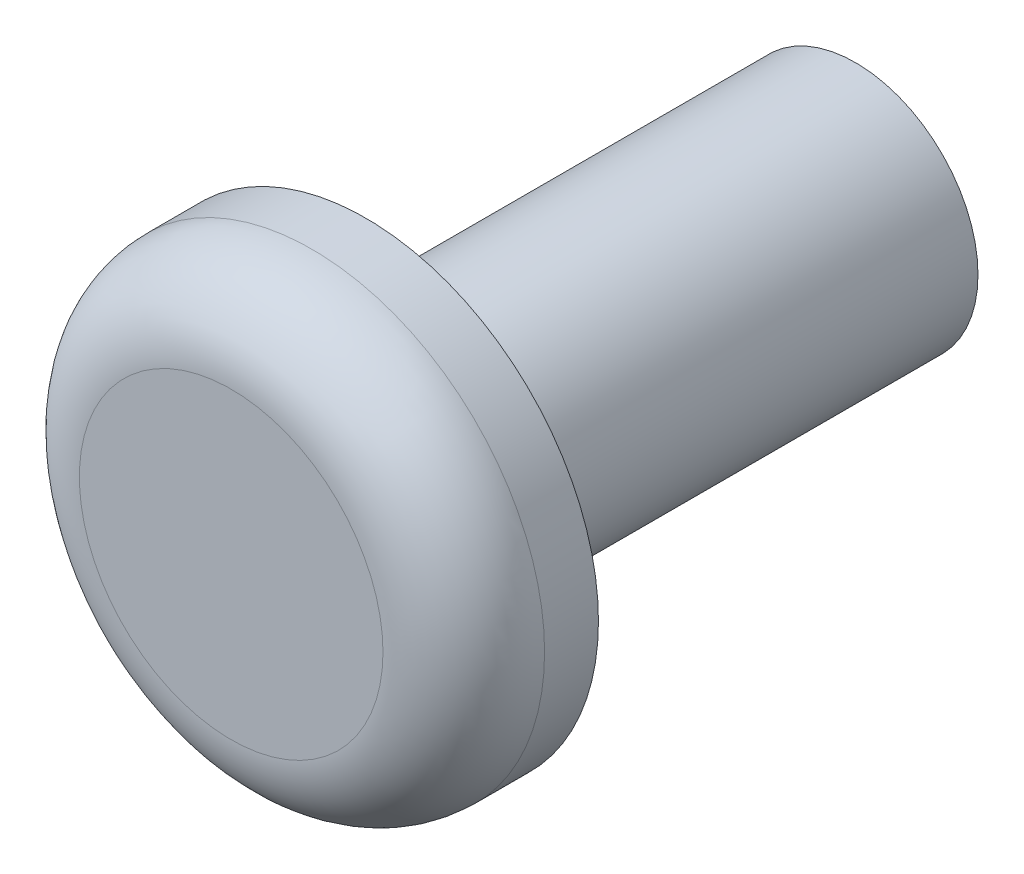
ISO-10303-21;
HEADER;
FILE_DESCRIPTION(('STEP AP214'),'2;1');
FILE_NAME('part.step','',(''),(''),'','','');
FILE_SCHEMA(('AUTOMOTIVE_DESIGN { 1 0 10303 214 1 1 1 1 }'));
ENDSEC;
DATA;
#1=APPLICATION_CONTEXT('core data for automotive mechanical design processes');
#2=APPLICATION_PROTOCOL_DEFINITION('international standard','automotive_design',2000,#1);
#3=PRODUCT_CONTEXT('',#1,'mechanical');
#4=PRODUCT('Part','Part','',(#3));
#5=PRODUCT_RELATED_PRODUCT_CATEGORY('part','',(#4));
#6=PRODUCT_DEFINITION_FORMATION('','',#4);
#7=PRODUCT_DEFINITION_CONTEXT('part definition',#1,'design');
#8=PRODUCT_DEFINITION('design','',#6,#7);
#9=PRODUCT_DEFINITION_SHAPE('','',#8);
#10=(LENGTH_UNIT() NAMED_UNIT(*) SI_UNIT(.MILLI.,.METRE.));
#11=(NAMED_UNIT(*) PLANE_ANGLE_UNIT() SI_UNIT($,.RADIAN.));
#12=(NAMED_UNIT(*) SI_UNIT($,.STERADIAN.) SOLID_ANGLE_UNIT());
#13=UNCERTAINTY_MEASURE_WITH_UNIT(LENGTH_MEASURE(1.E-05),#10,'distance_accuracy_value','');
#14=(GEOMETRIC_REPRESENTATION_CONTEXT(3) GLOBAL_UNCERTAINTY_ASSIGNED_CONTEXT((#13)) GLOBAL_UNIT_ASSIGNED_CONTEXT((#10,
#11,#12)) REPRESENTATION_CONTEXT('',''));
#15=CARTESIAN_POINT('',(0.,0.,0.));
#16=DIRECTION('',(0.,0.,1.));
#17=DIRECTION('',(1.,0.,0.));
#18=AXIS2_PLACEMENT_3D('',#15,#16,#17);
#19=CARTESIAN_POINT('',(0.,0.,-10.));
#20=DIRECTION('',(0.,0.,1.));
#21=DIRECTION('',(1.,0.,0.));
#22=AXIS2_PLACEMENT_3D('',#19,#20,#21);
#23=PLANE('',#22);
#24=CARTESIAN_POINT('',(0.,0.,-10.));
#25=DIRECTION('',(0.,0.,1.));
#26=DIRECTION('',(1.,0.,0.));
#27=AXIS2_PLACEMENT_3D('',#24,#25,#26);
#28=CIRCLE('',#27,2.5);
#29=CARTESIAN_POINT('',(2.5,0.,-10.));
#30=VERTEX_POINT('',#29);
#31=EDGE_CURVE('E10',#30,#30,#28,.T.);
#32=ORIENTED_EDGE('',*,*,#31,.F.);
#33=EDGE_LOOP('',(#32));
#34=FACE_BOUND('',#33,.T.);
#35=ADVANCED_FACE('F15',(#34),#23,.F.);
#36=CARTESIAN_POINT('',(0.,0.,0.));
#37=DIRECTION('',(0.,0.,1.));
#38=DIRECTION('',(1.,0.,0.));
#39=AXIS2_PLACEMENT_3D('',#36,#37,#38);
#40=CYLINDRICAL_SURFACE('',#39,2.5);
#41=ORIENTED_EDGE('',*,*,#31,.T.);
#42=EDGE_LOOP('',(#41));
#43=FACE_BOUND('',#42,.T.);
#44=CARTESIAN_POINT('',(0.,0.,0.));
#45=DIRECTION('',(0.,0.,1.));
#46=DIRECTION('',(1.,0.,0.));
#47=AXIS2_PLACEMENT_3D('',#44,#45,#46);
#48=CIRCLE('',#47,2.5);
#49=CARTESIAN_POINT('',(2.5,0.,0.));
#50=VERTEX_POINT('',#49);
#51=EDGE_CURVE('E22',#50,#50,#48,.T.);
#52=ORIENTED_EDGE('',*,*,#51,.F.);
#53=EDGE_LOOP('',(#52));
#54=FACE_BOUND('',#53,.T.);
#55=ADVANCED_FACE('F62',(#43,#54),#40,.T.);
#56=CARTESIAN_POINT('',(0.,0.,2.75));
#57=DIRECTION('',(0.,0.,1.));
#58=DIRECTION('',(1.,0.,0.));
#59=AXIS2_PLACEMENT_3D('',#56,#57,#58);
#60=PLANE('',#59);
#61=CARTESIAN_POINT('',(0.,0.,2.75));
#62=DIRECTION('',(0.,0.,1.));
#63=DIRECTION('',(1.,0.,0.));
#64=AXIS2_PLACEMENT_3D('',#61,#62,#63);
#65=CIRCLE('',#64,3.1);
#66=CARTESIAN_POINT('',(3.1,0.,2.75));
#67=VERTEX_POINT('',#66);
#68=EDGE_CURVE('E28',#67,#67,#65,.T.);
#69=ORIENTED_EDGE('',*,*,#68,.T.);
#70=EDGE_LOOP('',(#69));
#71=FACE_BOUND('',#70,.T.);
#72=ADVANCED_FACE('F52',(#71),#60,.T.);
#73=CARTESIAN_POINT('',(0.,0.,0.));
#74=DIRECTION('',(0.,0.,1.));
#75=DIRECTION('',(1.,0.,0.));
#76=AXIS2_PLACEMENT_3D('',#73,#74,#75);
#77=PLANE('',#76);
#78=ORIENTED_EDGE('',*,*,#51,.T.);
#79=EDGE_LOOP('',(#78));
#80=FACE_BOUND('',#79,.T.);
#81=CARTESIAN_POINT('',(0.,0.,0.));
#82=DIRECTION('',(0.,0.,1.));
#83=DIRECTION('',(1.,0.,0.));
#84=AXIS2_PLACEMENT_3D('',#81,#82,#83);
#85=CIRCLE('',#84,4.75);
#86=CARTESIAN_POINT('',(4.75,0.,0.));
#87=VERTEX_POINT('',#86);
#88=EDGE_CURVE('E45',#87,#87,#85,.T.);
#89=ORIENTED_EDGE('',*,*,#88,.F.);
#90=EDGE_LOOP('',(#89));
#91=FACE_BOUND('',#90,.T.);
#92=ADVANCED_FACE('F49',(#80,#91),#77,.F.);
#93=CARTESIAN_POINT('',(0.,0.,1.09999999999999));
#94=DIRECTION('',(0.,0.,1.));
#95=DIRECTION('',(1.,0.,0.));
#96=AXIS2_PLACEMENT_3D('',#93,#94,#95);
#97=TOROIDAL_SURFACE('',#96,3.1,1.65);
#98=ORIENTED_EDGE('',*,*,#68,.F.);
#99=EDGE_LOOP('',(#98));
#100=FACE_BOUND('',#99,.T.);
#101=CARTESIAN_POINT('',(0.,0.,1.09999999999999));
#102=DIRECTION('',(0.,0.,1.));
#103=DIRECTION('',(1.,0.,0.));
#104=AXIS2_PLACEMENT_3D('',#101,#102,#103);
#105=CIRCLE('',#104,4.75);
#106=CARTESIAN_POINT('',(4.75,0.,1.09999999999999));
#107=VERTEX_POINT('',#106);
#108=EDGE_CURVE('E38',#107,#107,#105,.T.);
#109=ORIENTED_EDGE('',*,*,#108,.T.);
#110=EDGE_LOOP('',(#109));
#111=FACE_BOUND('',#110,.T.);
#112=ADVANCED_FACE('F55',(#100,#111),#97,.T.);
#113=CARTESIAN_POINT('',(0.,0.,0.));
#114=DIRECTION('',(0.,0.,-1.));
#115=DIRECTION('',(1.,0.,0.));
#116=AXIS2_PLACEMENT_3D('',#113,#114,#115);
#117=CYLINDRICAL_SURFACE('',#116,4.75);
#118=ORIENTED_EDGE('',*,*,#108,.F.);
#119=EDGE_LOOP('',(#118));
#120=FACE_BOUND('',#119,.T.);
#121=ORIENTED_EDGE('',*,*,#88,.T.);
#122=EDGE_LOOP('',(#121));
#123=FACE_BOUND('',#122,.T.);
#124=ADVANCED_FACE('F48',(#120,#123),#117,.T.);
#125=CLOSED_SHELL('',(#35,#55,#72,#92,#112,#124));
#126=MANIFOLD_SOLID_BREP('B1',#125);
#127=ADVANCED_BREP_SHAPE_REPRESENTATION('',(#18,#126),#14);
#128=SHAPE_DEFINITION_REPRESENTATION(#9,#127);
ENDSEC;
END-ISO-10303-21;
